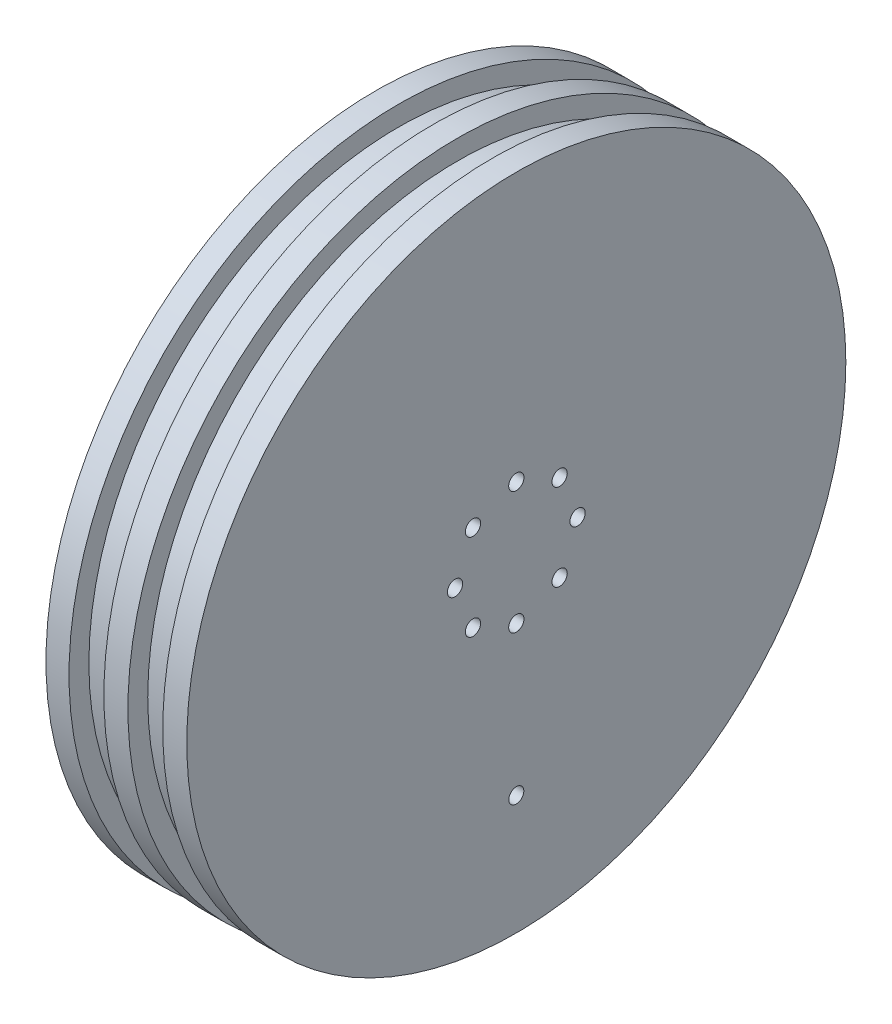
ISO-10303-21;
HEADER;
FILE_DESCRIPTION(('STEP AP214'),'2;1');
FILE_NAME('part.step','',(''),(''),'','','');
FILE_SCHEMA(('AUTOMOTIVE_DESIGN { 1 0 10303 214 1 1 1 1 }'));
ENDSEC;
DATA;
#1=APPLICATION_CONTEXT('core data for automotive mechanical design processes');
#2=APPLICATION_PROTOCOL_DEFINITION('international standard','automotive_design',2000,#1);
#3=PRODUCT_CONTEXT('',#1,'mechanical');
#4=PRODUCT('Part','Part','',(#3));
#5=PRODUCT_RELATED_PRODUCT_CATEGORY('part','',(#4));
#6=PRODUCT_DEFINITION_FORMATION('','',#4);
#7=PRODUCT_DEFINITION_CONTEXT('part definition',#1,'design');
#8=PRODUCT_DEFINITION('design','',#6,#7);
#9=PRODUCT_DEFINITION_SHAPE('','',#8);
#10=(LENGTH_UNIT() NAMED_UNIT(*) SI_UNIT(.MILLI.,.METRE.));
#11=(NAMED_UNIT(*) PLANE_ANGLE_UNIT() SI_UNIT($,.RADIAN.));
#12=(NAMED_UNIT(*) SI_UNIT($,.STERADIAN.) SOLID_ANGLE_UNIT());
#13=UNCERTAINTY_MEASURE_WITH_UNIT(LENGTH_MEASURE(1.E-05),#10,'distance_accuracy_value','');
#14=(GEOMETRIC_REPRESENTATION_CONTEXT(3) GLOBAL_UNCERTAINTY_ASSIGNED_CONTEXT((#13)) GLOBAL_UNIT_ASSIGNED_CONTEXT((#10,
#11,#12)) REPRESENTATION_CONTEXT('',''));
#15=CARTESIAN_POINT('',(0.,0.,0.));
#16=DIRECTION('',(0.,0.,1.));
#17=DIRECTION('',(1.,0.,0.));
#18=AXIS2_PLACEMENT_3D('',#15,#16,#17);
#19=CARTESIAN_POINT('',(-14.885,0.,0.));
#20=DIRECTION('',(-1.,0.,0.));
#21=DIRECTION('',(0.,0.,1.));
#22=AXIS2_PLACEMENT_3D('',#19,#20,#21);
#23=PLANE('',#22);
#24=CARTESIAN_POINT('',(-14.885,0.,0.));
#25=DIRECTION('',(1.,0.,0.));
#26=DIRECTION('',(0.,0.,-1.));
#27=AXIS2_PLACEMENT_3D('',#24,#25,#26);
#28=CIRCLE('',#27,29.1592);
#29=CARTESIAN_POINT('',(-14.885,0.,-29.1592));
#30=VERTEX_POINT('',#29);
#31=EDGE_CURVE('E11',#30,#30,#28,.T.);
#32=ORIENTED_EDGE('',*,*,#31,.T.);
#33=EDGE_LOOP('',(#32));
#34=FACE_BOUND('',#33,.T.);
#35=CARTESIAN_POINT('',(-14.885,0.,0.));
#36=DIRECTION('',(1.,0.,0.));
#37=DIRECTION('',(0.,0.,-1.));
#38=AXIS2_PLACEMENT_3D('',#35,#36,#37);
#39=CIRCLE('',#38,34.8361);
#40=CARTESIAN_POINT('',(-14.885,0.,-34.8361));
#41=VERTEX_POINT('',#40);
#42=EDGE_CURVE('E93',#41,#41,#39,.T.);
#43=ORIENTED_EDGE('',*,*,#42,.F.);
#44=EDGE_LOOP('',(#43));
#45=FACE_BOUND('',#44,.T.);
#46=ADVANCED_FACE('F37',(#34,#45),#23,.T.);
#47=CARTESIAN_POINT('',(17.7798798469095,0.,0.));
#48=DIRECTION('',(1.,0.,0.));
#49=DIRECTION('',(0.,0.,-1.));
#50=AXIS2_PLACEMENT_3D('',#47,#48,#49);
#51=CYLINDRICAL_SURFACE('',#50,29.1592);
#52=CARTESIAN_POINT('',(-18.06,0.,0.));
#53=DIRECTION('',(1.,0.,0.));
#54=DIRECTION('',(0.,0.,-1.));
#55=AXIS2_PLACEMENT_3D('',#52,#53,#54);
#56=CIRCLE('',#55,29.1592);
#57=CARTESIAN_POINT('',(-18.06,0.,-29.1592));
#58=VERTEX_POINT('',#57);
#59=EDGE_CURVE('E45',#58,#58,#56,.T.);
#60=ORIENTED_EDGE('',*,*,#59,.T.);
#61=EDGE_LOOP('',(#60));
#62=FACE_BOUND('',#61,.T.);
#63=ORIENTED_EDGE('',*,*,#31,.F.);
#64=EDGE_LOOP('',(#63));
#65=FACE_BOUND('',#64,.T.);
#66=ADVANCED_FACE('F126',(#62,#65),#51,.T.);
#67=CARTESIAN_POINT('',(-18.06,0.,0.));
#68=DIRECTION('',(-1.,0.,0.));
#69=DIRECTION('',(0.,0.,1.));
#70=AXIS2_PLACEMENT_3D('',#67,#68,#69);
#71=PLANE('',#70);
#72=CARTESIAN_POINT('',(-18.06,-22.225,-1.49186218934006E-13));
#73=DIRECTION('',(-1.,0.,0.));
#74=DIRECTION('',(0.,0.,1.));
#75=AXIS2_PLACEMENT_3D('',#72,#73,#74);
#76=CIRCLE('',#75,4.21639999999999);
#77=CARTESIAN_POINT('',(-18.06,-22.225,4.21639999999984));
#78=VERTEX_POINT('',#77);
#79=EDGE_CURVE('E280',#78,#78,#76,.T.);
#80=ORIENTED_EDGE('',*,*,#79,.F.);
#81=EDGE_LOOP('',(#80));
#82=FACE_BOUND('',#81,.T.);
#83=CARTESIAN_POINT('',(-18.06,6.477,0.));
#84=DIRECTION('',(-1.,0.,0.));
#85=DIRECTION('',(0.,0.,1.));
#86=AXIS2_PLACEMENT_3D('',#83,#84,#85);
#87=CIRCLE('',#86,0.80645);
#88=CARTESIAN_POINT('',(-18.06,6.477,0.80645));
#89=VERTEX_POINT('',#88);
#90=EDGE_CURVE('E75',#89,#89,#87,.F.);
#91=ORIENTED_EDGE('',*,*,#90,.T.);
#92=EDGE_LOOP('',(#91));
#93=FACE_BOUND('',#92,.T.);
#94=CARTESIAN_POINT('',(-18.06,4.57993062174527,-4.57993062174527));
#95=DIRECTION('',(-1.,0.,0.));
#96=DIRECTION('',(0.,0.,1.));
#97=AXIS2_PLACEMENT_3D('',#94,#95,#96);
#98=CIRCLE('',#97,0.80645);
#99=CARTESIAN_POINT('',(-18.06,4.57993062174527,-3.77348062174527));
#100=VERTEX_POINT('',#99);
#101=EDGE_CURVE('E291',#100,#100,#98,.F.);
#102=ORIENTED_EDGE('',*,*,#101,.T.);
#103=EDGE_LOOP('',(#102));
#104=FACE_BOUND('',#103,.T.);
#105=CARTESIAN_POINT('',(-18.06,0.,-6.477));
#106=DIRECTION('',(-1.,0.,0.));
#107=DIRECTION('',(0.,0.,1.));
#108=AXIS2_PLACEMENT_3D('',#105,#106,#107);
#109=CIRCLE('',#108,0.80645);
#110=CARTESIAN_POINT('',(-18.06,0.,-5.67055));
#111=VERTEX_POINT('',#110);
#112=EDGE_CURVE('E297',#111,#111,#109,.F.);
#113=ORIENTED_EDGE('',*,*,#112,.T.);
#114=EDGE_LOOP('',(#113));
#115=FACE_BOUND('',#114,.T.);
#116=CARTESIAN_POINT('',(-18.06,-4.57993062174527,-4.57993062174527));
#117=DIRECTION('',(-1.,0.,0.));
#118=DIRECTION('',(0.,0.,1.));
#119=AXIS2_PLACEMENT_3D('',#116,#117,#118);
#120=CIRCLE('',#119,0.80645);
#121=CARTESIAN_POINT('',(-18.06,-4.57993062174527,-3.77348062174527));
#122=VERTEX_POINT('',#121);
#123=EDGE_CURVE('E303',#122,#122,#120,.F.);
#124=ORIENTED_EDGE('',*,*,#123,.T.);
#125=EDGE_LOOP('',(#124));
#126=FACE_BOUND('',#125,.T.);
#127=CARTESIAN_POINT('',(-18.06,-6.477,0.));
#128=DIRECTION('',(-1.,0.,0.));
#129=DIRECTION('',(0.,0.,1.));
#130=AXIS2_PLACEMENT_3D('',#127,#128,#129);
#131=CIRCLE('',#130,0.80645);
#132=CARTESIAN_POINT('',(-18.06,-6.477,0.806449999999999));
#133=VERTEX_POINT('',#132);
#134=EDGE_CURVE('E309',#133,#133,#131,.F.);
#135=ORIENTED_EDGE('',*,*,#134,.T.);
#136=EDGE_LOOP('',(#135));
#137=FACE_BOUND('',#136,.T.);
#138=CARTESIAN_POINT('',(-18.06,-4.57993062174527,4.57993062174527));
#139=DIRECTION('',(-1.,0.,0.));
#140=DIRECTION('',(0.,0.,1.));
#141=AXIS2_PLACEMENT_3D('',#138,#139,#140);
#142=CIRCLE('',#141,0.80645);
#143=CARTESIAN_POINT('',(-18.06,-4.57993062174527,5.38638062174527));
#144=VERTEX_POINT('',#143);
#145=EDGE_CURVE('E315',#144,#144,#142,.F.);
#146=ORIENTED_EDGE('',*,*,#145,.T.);
#147=EDGE_LOOP('',(#146));
#148=FACE_BOUND('',#147,.T.);
#149=CARTESIAN_POINT('',(-18.06,0.,6.477));
#150=DIRECTION('',(-1.,0.,0.));
#151=DIRECTION('',(0.,0.,1.));
#152=AXIS2_PLACEMENT_3D('',#149,#150,#151);
#153=CIRCLE('',#152,0.80645);
#154=CARTESIAN_POINT('',(-18.06,0.,7.28345));
#155=VERTEX_POINT('',#154);
#156=EDGE_CURVE('E321',#155,#155,#153,.F.);
#157=ORIENTED_EDGE('',*,*,#156,.T.);
#158=EDGE_LOOP('',(#157));
#159=FACE_BOUND('',#158,.T.);
#160=CARTESIAN_POINT('',(-18.06,4.57993062174527,4.57993062174527));
#161=DIRECTION('',(-1.,0.,0.));
#162=DIRECTION('',(0.,0.,1.));
#163=AXIS2_PLACEMENT_3D('',#160,#161,#162);
#164=CIRCLE('',#163,0.80645);
#165=CARTESIAN_POINT('',(-18.06,4.57993062174527,5.38638062174527));
#166=VERTEX_POINT('',#165);
#167=EDGE_CURVE('E327',#166,#166,#164,.F.);
#168=ORIENTED_EDGE('',*,*,#167,.T.);
#169=EDGE_LOOP('',(#168));
#170=FACE_BOUND('',#169,.T.);
#171=CARTESIAN_POINT('',(-18.06,10.31875,17.8725992706014));
#172=DIRECTION('',(-1.,0.,0.));
#173=DIRECTION('',(0.,0.,1.));
#174=AXIS2_PLACEMENT_3D('',#171,#172,#173);
#175=CIRCLE('',#174,0.888999999999989);
#176=CARTESIAN_POINT('',(-18.06,10.31875,18.7615992706014));
#177=VERTEX_POINT('',#176);
#178=EDGE_CURVE('E69',#177,#177,#175,.T.);
#179=ORIENTED_EDGE('',*,*,#178,.F.);
#180=EDGE_LOOP('',(#179));
#181=FACE_BOUND('',#180,.T.);
#182=CARTESIAN_POINT('',(-18.06,-10.3187499999998,-17.8725992706014));
#183=DIRECTION('',(-1.,0.,0.));
#184=DIRECTION('',(0.,0.,1.));
#185=AXIS2_PLACEMENT_3D('',#182,#183,#184);
#186=CIRCLE('',#185,2.0447);
#187=CARTESIAN_POINT('',(-18.06,-10.3187499999998,-15.8278992706015));
#188=VERTEX_POINT('',#187);
#189=EDGE_CURVE('E68',#188,#188,#186,.T.);
#190=ORIENTED_EDGE('',*,*,#189,.F.);
#191=EDGE_LOOP('',(#190));
#192=FACE_BOUND('',#191,.T.);
#193=CARTESIAN_POINT('',(-18.06,-10.3187500000001,17.8725992706013));
#194=DIRECTION('',(-1.,0.,0.));
#195=DIRECTION('',(0.,0.,1.));
#196=AXIS2_PLACEMENT_3D('',#193,#194,#195);
#197=CIRCLE('',#196,2.0447);
#198=CARTESIAN_POINT('',(-18.06,-10.3187500000001,19.9172992706013));
#199=VERTEX_POINT('',#198);
#200=EDGE_CURVE('E81',#199,#199,#197,.T.);
#201=ORIENTED_EDGE('',*,*,#200,.F.);
#202=EDGE_LOOP('',(#201));
#203=FACE_BOUND('',#202,.T.);
#204=CARTESIAN_POINT('',(-18.06,20.6375,0.));
#205=DIRECTION('',(-1.,0.,0.));
#206=DIRECTION('',(0.,0.,1.));
#207=AXIS2_PLACEMENT_3D('',#204,#205,#206);
#208=CIRCLE('',#207,2.0447);
#209=CARTESIAN_POINT('',(-18.06,20.6375,2.0447));
#210=VERTEX_POINT('',#209);
#211=EDGE_CURVE('E87',#210,#210,#208,.T.);
#212=ORIENTED_EDGE('',*,*,#211,.F.);
#213=EDGE_LOOP('',(#212));
#214=FACE_BOUND('',#213,.T.);
#215=ORIENTED_EDGE('',*,*,#59,.F.);
#216=EDGE_LOOP('',(#215));
#217=FACE_BOUND('',#216,.T.);
#218=ADVANCED_FACE('F129',(#82,#93,#104,#115,#126,#137,#148,#159,#170,#181,#192,#203,#214,#217),
#71,.T.);
#219=CARTESIAN_POINT('',(0.,0.,0.));
#220=DIRECTION('',(1.,0.,0.));
#221=DIRECTION('',(0.,0.,-1.));
#222=AXIS2_PLACEMENT_3D('',#219,#220,#221);
#223=PLANE('',#222);
#224=CARTESIAN_POINT('',(0.,-22.225,-1.49186218934006E-13));
#225=DIRECTION('',(1.,0.,0.));
#226=DIRECTION('',(0.,0.,-1.));
#227=AXIS2_PLACEMENT_3D('',#224,#225,#226);
#228=CIRCLE('',#227,0.793749999999999);
#229=CARTESIAN_POINT('',(0.,-22.225,-0.793750000000149));
#230=VERTEX_POINT('',#229);
#231=EDGE_CURVE('E284',#230,#230,#228,.T.);
#232=ORIENTED_EDGE('',*,*,#231,.F.);
#233=EDGE_LOOP('',(#232));
#234=FACE_BOUND('',#233,.T.);
#235=CARTESIAN_POINT('',(0.,6.477,0.));
#236=DIRECTION('',(1.,0.,0.));
#237=DIRECTION('',(0.,0.,-1.));
#238=AXIS2_PLACEMENT_3D('',#235,#236,#237);
#239=CIRCLE('',#238,0.80645);
#240=CARTESIAN_POINT('',(0.,6.477,-0.80645));
#241=VERTEX_POINT('',#240);
#242=EDGE_CURVE('E288',#241,#241,#239,.T.);
#243=ORIENTED_EDGE('',*,*,#242,.F.);
#244=EDGE_LOOP('',(#243));
#245=FACE_BOUND('',#244,.T.);
#246=CARTESIAN_POINT('',(0.,4.57993062174527,-4.57993062174527));
#247=DIRECTION('',(1.,0.,0.));
#248=DIRECTION('',(0.,0.,-1.));
#249=AXIS2_PLACEMENT_3D('',#246,#247,#248);
#250=CIRCLE('',#249,0.80645);
#251=CARTESIAN_POINT('',(0.,4.57993062174527,-5.38638062174527));
#252=VERTEX_POINT('',#251);
#253=EDGE_CURVE('E294',#252,#252,#250,.T.);
#254=ORIENTED_EDGE('',*,*,#253,.F.);
#255=EDGE_LOOP('',(#254));
#256=FACE_BOUND('',#255,.T.);
#257=CARTESIAN_POINT('',(0.,0.,-6.477));
#258=DIRECTION('',(1.,0.,0.));
#259=DIRECTION('',(0.,0.,-1.));
#260=AXIS2_PLACEMENT_3D('',#257,#258,#259);
#261=CIRCLE('',#260,0.80645);
#262=CARTESIAN_POINT('',(0.,0.,-7.28345));
#263=VERTEX_POINT('',#262);
#264=EDGE_CURVE('E300',#263,#263,#261,.T.);
#265=ORIENTED_EDGE('',*,*,#264,.F.);
#266=EDGE_LOOP('',(#265));
#267=FACE_BOUND('',#266,.T.);
#268=CARTESIAN_POINT('',(0.,-4.57993062174527,-4.57993062174527));
#269=DIRECTION('',(1.,0.,0.));
#270=DIRECTION('',(0.,0.,-1.));
#271=AXIS2_PLACEMENT_3D('',#268,#269,#270);
#272=CIRCLE('',#271,0.80645);
#273=CARTESIAN_POINT('',(0.,-4.57993062174527,-5.38638062174527));
#274=VERTEX_POINT('',#273);
#275=EDGE_CURVE('E306',#274,#274,#272,.T.);
#276=ORIENTED_EDGE('',*,*,#275,.F.);
#277=EDGE_LOOP('',(#276));
#278=FACE_BOUND('',#277,.T.);
#279=CARTESIAN_POINT('',(0.,-6.477,0.));
#280=DIRECTION('',(1.,0.,0.));
#281=DIRECTION('',(0.,0.,-1.));
#282=AXIS2_PLACEMENT_3D('',#279,#280,#281);
#283=CIRCLE('',#282,0.80645);
#284=CARTESIAN_POINT('',(0.,-6.477,-0.806450000000001));
#285=VERTEX_POINT('',#284);
#286=EDGE_CURVE('E312',#285,#285,#283,.T.);
#287=ORIENTED_EDGE('',*,*,#286,.F.);
#288=EDGE_LOOP('',(#287));
#289=FACE_BOUND('',#288,.T.);
#290=CARTESIAN_POINT('',(0.,-4.57993062174527,4.57993062174527));
#291=DIRECTION('',(1.,0.,0.));
#292=DIRECTION('',(0.,0.,-1.));
#293=AXIS2_PLACEMENT_3D('',#290,#291,#292);
#294=CIRCLE('',#293,0.80645);
#295=CARTESIAN_POINT('',(0.,-4.57993062174527,3.77348062174527));
#296=VERTEX_POINT('',#295);
#297=EDGE_CURVE('E318',#296,#296,#294,.T.);
#298=ORIENTED_EDGE('',*,*,#297,.F.);
#299=EDGE_LOOP('',(#298));
#300=FACE_BOUND('',#299,.T.);
#301=CARTESIAN_POINT('',(0.,0.,6.477));
#302=DIRECTION('',(1.,0.,0.));
#303=DIRECTION('',(0.,0.,-1.));
#304=AXIS2_PLACEMENT_3D('',#301,#302,#303);
#305=CIRCLE('',#304,0.80645);
#306=CARTESIAN_POINT('',(0.,0.,5.67055));
#307=VERTEX_POINT('',#306);
#308=EDGE_CURVE('E324',#307,#307,#305,.T.);
#309=ORIENTED_EDGE('',*,*,#308,.F.);
#310=EDGE_LOOP('',(#309));
#311=FACE_BOUND('',#310,.T.);
#312=CARTESIAN_POINT('',(0.,4.57993062174527,4.57993062174527));
#313=DIRECTION('',(1.,0.,0.));
#314=DIRECTION('',(0.,0.,-1.));
#315=AXIS2_PLACEMENT_3D('',#312,#313,#314);
#316=CIRCLE('',#315,0.80645);
#317=CARTESIAN_POINT('',(0.,4.57993062174527,3.77348062174527));
#318=VERTEX_POINT('',#317);
#319=EDGE_CURVE('E287',#318,#318,#316,.T.);
#320=ORIENTED_EDGE('',*,*,#319,.F.);
#321=EDGE_LOOP('',(#320));
#322=FACE_BOUND('',#321,.T.);
#323=CARTESIAN_POINT('',(0.,0.,0.));
#324=DIRECTION('',(1.,0.,0.));
#325=DIRECTION('',(0.,0.,-1.));
#326=AXIS2_PLACEMENT_3D('',#323,#324,#325);
#327=CIRCLE('',#326,34.8361);
#328=CARTESIAN_POINT('',(0.,0.,-34.8361));
#329=VERTEX_POINT('',#328);
#330=EDGE_CURVE('E120',#329,#329,#327,.T.);
#331=ORIENTED_EDGE('',*,*,#330,.T.);
#332=EDGE_LOOP('',(#331));
#333=FACE_BOUND('',#332,.T.);
#334=ADVANCED_FACE('F131',(#234,#245,#256,#267,#278,#289,#300,#311,#322,#333),#223,.T.);
#335=CARTESIAN_POINT('',(17.7798798469095,0.,0.));
#336=DIRECTION('',(1.,0.,0.));
#337=DIRECTION('',(0.,0.,-1.));
#338=AXIS2_PLACEMENT_3D('',#335,#336,#337);
#339=CYLINDRICAL_SURFACE('',#338,34.8361);
#340=CARTESIAN_POINT('',(-2.53999999999999,0.,0.));
#341=DIRECTION('',(1.,0.,0.));
#342=DIRECTION('',(0.,0.,-1.));
#343=AXIS2_PLACEMENT_3D('',#340,#341,#342);
#344=CIRCLE('',#343,34.8361);
#345=CARTESIAN_POINT('',(-2.53999999999999,0.,-34.8361));
#346=VERTEX_POINT('',#345);
#347=EDGE_CURVE('E117',#346,#346,#344,.T.);
#348=ORIENTED_EDGE('',*,*,#347,.T.);
#349=EDGE_LOOP('',(#348));
#350=FACE_BOUND('',#349,.T.);
#351=ORIENTED_EDGE('',*,*,#330,.F.);
#352=EDGE_LOOP('',(#351));
#353=FACE_BOUND('',#352,.T.);
#354=ADVANCED_FACE('F138',(#350,#353),#339,.T.);
#355=CARTESIAN_POINT('',(-2.53999999999999,0.,0.));
#356=DIRECTION('',(-1.,0.,0.));
#357=DIRECTION('',(0.,0.,1.));
#358=AXIS2_PLACEMENT_3D('',#355,#356,#357);
#359=PLANE('',#358);
#360=CARTESIAN_POINT('',(-2.53999999999999,0.,0.));
#361=DIRECTION('',(1.,0.,0.));
#362=DIRECTION('',(0.,0.,-1.));
#363=AXIS2_PLACEMENT_3D('',#360,#361,#362);
#364=CIRCLE('',#363,32.7406);
#365=CARTESIAN_POINT('',(-2.53999999999999,0.,-32.7406));
#366=VERTEX_POINT('',#365);
#367=EDGE_CURVE('E114',#366,#366,#364,.T.);
#368=ORIENTED_EDGE('',*,*,#367,.T.);
#369=EDGE_LOOP('',(#368));
#370=FACE_BOUND('',#369,.T.);
#371=ORIENTED_EDGE('',*,*,#347,.F.);
#372=EDGE_LOOP('',(#371));
#373=FACE_BOUND('',#372,.T.);
#374=ADVANCED_FACE('F191',(#370,#373),#359,.T.);
#375=CARTESIAN_POINT('',(17.7798798469095,0.,0.));
#376=DIRECTION('',(1.,0.,0.));
#377=DIRECTION('',(0.,0.,-1.));
#378=AXIS2_PLACEMENT_3D('',#375,#376,#377);
#379=CYLINDRICAL_SURFACE('',#378,32.7406);
#380=CARTESIAN_POINT('',(-6.223,0.,0.));
#381=DIRECTION('',(1.,0.,0.));
#382=DIRECTION('',(0.,0.,-1.));
#383=AXIS2_PLACEMENT_3D('',#380,#381,#382);
#384=CIRCLE('',#383,32.7406);
#385=CARTESIAN_POINT('',(-6.223,0.,-32.7406));
#386=VERTEX_POINT('',#385);
#387=EDGE_CURVE('E111',#386,#386,#384,.T.);
#388=ORIENTED_EDGE('',*,*,#387,.T.);
#389=EDGE_LOOP('',(#388));
#390=FACE_BOUND('',#389,.T.);
#391=ORIENTED_EDGE('',*,*,#367,.F.);
#392=EDGE_LOOP('',(#391));
#393=FACE_BOUND('',#392,.T.);
#394=ADVANCED_FACE('F185',(#390,#393),#379,.T.);
#395=CARTESIAN_POINT('',(-6.22299999999999,0.,0.));
#396=DIRECTION('',(1.,0.,0.));
#397=DIRECTION('',(0.,0.,-1.));
#398=AXIS2_PLACEMENT_3D('',#395,#396,#397);
#399=PLANE('',#398);
#400=CARTESIAN_POINT('',(-6.22299999999999,0.,0.));
#401=DIRECTION('',(1.,0.,0.));
#402=DIRECTION('',(0.,0.,-1.));
#403=AXIS2_PLACEMENT_3D('',#400,#401,#402);
#404=CIRCLE('',#403,34.8361);
#405=CARTESIAN_POINT('',(-6.22299999999999,0.,-34.8361));
#406=VERTEX_POINT('',#405);
#407=EDGE_CURVE('E108',#406,#406,#404,.T.);
#408=ORIENTED_EDGE('',*,*,#407,.T.);
#409=EDGE_LOOP('',(#408));
#410=FACE_BOUND('',#409,.T.);
#411=ORIENTED_EDGE('',*,*,#387,.F.);
#412=EDGE_LOOP('',(#411));
#413=FACE_BOUND('',#412,.T.);
#414=ADVANCED_FACE('F179',(#410,#413),#399,.T.);
#415=CARTESIAN_POINT('',(17.7798798469095,0.,0.));
#416=DIRECTION('',(1.,0.,0.));
#417=DIRECTION('',(0.,0.,-1.));
#418=AXIS2_PLACEMENT_3D('',#415,#416,#417);
#419=CYLINDRICAL_SURFACE('',#418,34.8361);
#420=CARTESIAN_POINT('',(-8.76299999999999,0.,0.));
#421=DIRECTION('',(1.,0.,0.));
#422=DIRECTION('',(0.,0.,-1.));
#423=AXIS2_PLACEMENT_3D('',#420,#421,#422);
#424=CIRCLE('',#423,34.8361);
#425=CARTESIAN_POINT('',(-8.76299999999999,0.,-34.8361));
#426=VERTEX_POINT('',#425);
#427=EDGE_CURVE('E105',#426,#426,#424,.T.);
#428=ORIENTED_EDGE('',*,*,#427,.T.);
#429=EDGE_LOOP('',(#428));
#430=FACE_BOUND('',#429,.T.);
#431=ORIENTED_EDGE('',*,*,#407,.F.);
#432=EDGE_LOOP('',(#431));
#433=FACE_BOUND('',#432,.T.);
#434=ADVANCED_FACE('F173',(#430,#433),#419,.T.);
#435=CARTESIAN_POINT('',(-8.76299999999999,0.,0.));
#436=DIRECTION('',(-1.,0.,0.));
#437=DIRECTION('',(0.,0.,1.));
#438=AXIS2_PLACEMENT_3D('',#435,#436,#437);
#439=PLANE('',#438);
#440=CARTESIAN_POINT('',(-8.76299999999999,0.,0.));
#441=DIRECTION('',(1.,0.,0.));
#442=DIRECTION('',(0.,0.,-1.));
#443=AXIS2_PLACEMENT_3D('',#440,#441,#442);
#444=CIRCLE('',#443,32.7406);
#445=CARTESIAN_POINT('',(-8.76299999999999,0.,-32.7406));
#446=VERTEX_POINT('',#445);
#447=EDGE_CURVE('E102',#446,#446,#444,.T.);
#448=ORIENTED_EDGE('',*,*,#447,.T.);
#449=EDGE_LOOP('',(#448));
#450=FACE_BOUND('',#449,.T.);
#451=ORIENTED_EDGE('',*,*,#427,.F.);
#452=EDGE_LOOP('',(#451));
#453=FACE_BOUND('',#452,.T.);
#454=ADVANCED_FACE('F167',(#450,#453),#439,.T.);
#455=CARTESIAN_POINT('',(17.7798798469095,0.,0.));
#456=DIRECTION('',(1.,0.,0.));
#457=DIRECTION('',(0.,0.,-1.));
#458=AXIS2_PLACEMENT_3D('',#455,#456,#457);
#459=CYLINDRICAL_SURFACE('',#458,32.7406);
#460=CARTESIAN_POINT('',(-12.446,0.,0.));
#461=DIRECTION('',(1.,0.,0.));
#462=DIRECTION('',(0.,0.,-1.));
#463=AXIS2_PLACEMENT_3D('',#460,#461,#462);
#464=CIRCLE('',#463,32.7406);
#465=CARTESIAN_POINT('',(-12.446,0.,-32.7406));
#466=VERTEX_POINT('',#465);
#467=EDGE_CURVE('E99',#466,#466,#464,.T.);
#468=ORIENTED_EDGE('',*,*,#467,.T.);
#469=EDGE_LOOP('',(#468));
#470=FACE_BOUND('',#469,.T.);
#471=ORIENTED_EDGE('',*,*,#447,.F.);
#472=EDGE_LOOP('',(#471));
#473=FACE_BOUND('',#472,.T.);
#474=ADVANCED_FACE('F161',(#470,#473),#459,.T.);
#475=CARTESIAN_POINT('',(-12.446,0.,0.));
#476=DIRECTION('',(1.,0.,0.));
#477=DIRECTION('',(0.,0.,-1.));
#478=AXIS2_PLACEMENT_3D('',#475,#476,#477);
#479=PLANE('',#478);
#480=CARTESIAN_POINT('',(-12.446,0.,0.));
#481=DIRECTION('',(1.,0.,0.));
#482=DIRECTION('',(0.,0.,-1.));
#483=AXIS2_PLACEMENT_3D('',#480,#481,#482);
#484=CIRCLE('',#483,34.8361);
#485=CARTESIAN_POINT('',(-12.446,0.,-34.8361));
#486=VERTEX_POINT('',#485);
#487=EDGE_CURVE('E96',#486,#486,#484,.T.);
#488=ORIENTED_EDGE('',*,*,#487,.T.);
#489=EDGE_LOOP('',(#488));
#490=FACE_BOUND('',#489,.T.);
#491=ORIENTED_EDGE('',*,*,#467,.F.);
#492=EDGE_LOOP('',(#491));
#493=FACE_BOUND('',#492,.T.);
#494=ADVANCED_FACE('F155',(#490,#493),#479,.T.);
#495=CARTESIAN_POINT('',(17.7798798469095,0.,0.));
#496=DIRECTION('',(1.,0.,0.));
#497=DIRECTION('',(0.,0.,-1.));
#498=AXIS2_PLACEMENT_3D('',#495,#496,#497);
#499=CYLINDRICAL_SURFACE('',#498,34.8361);
#500=ORIENTED_EDGE('',*,*,#42,.T.);
#501=EDGE_LOOP('',(#500));
#502=FACE_BOUND('',#501,.T.);
#503=ORIENTED_EDGE('',*,*,#487,.F.);
#504=EDGE_LOOP('',(#503));
#505=FACE_BOUND('',#504,.T.);
#506=ADVANCED_FACE('F151',(#502,#505),#499,.T.);
#507=CARTESIAN_POINT('',(-8.408,20.6375,0.));
#508=DIRECTION('',(-1.,0.,0.));
#509=DIRECTION('',(0.,0.,1.));
#510=AXIS2_PLACEMENT_3D('',#507,#508,#509);
#511=CONICAL_SURFACE('',#510,2.0447,1.02974425867665);
#512=CARTESIAN_POINT('',(-7.17942029227434,20.6375,0.));
#513=VERTEX_POINT('',#512);
#514=VERTEX_LOOP('',#513);
#515=FACE_BOUND('',#514,.T.);
#516=CARTESIAN_POINT('',(-8.408,20.6375,0.));
#517=DIRECTION('',(-1.,0.,0.));
#518=DIRECTION('',(0.,0.,1.));
#519=AXIS2_PLACEMENT_3D('',#516,#517,#518);
#520=CIRCLE('',#519,2.0447);
#521=CARTESIAN_POINT('',(-8.408,20.6375,2.0447));
#522=VERTEX_POINT('',#521);
#523=EDGE_CURVE('E90',#522,#522,#520,.T.);
#524=ORIENTED_EDGE('',*,*,#523,.T.);
#525=EDGE_LOOP('',(#524));
#526=FACE_BOUND('',#525,.T.);
#527=ADVANCED_FACE('F154',(#515,#526),#511,.F.);
#528=CARTESIAN_POINT('',(-18.06,20.6375,0.));
#529=DIRECTION('',(-1.,0.,0.));
#530=DIRECTION('',(0.,0.,1.));
#531=AXIS2_PLACEMENT_3D('',#528,#529,#530);
#532=CYLINDRICAL_SURFACE('',#531,2.0447);
#533=ORIENTED_EDGE('',*,*,#523,.F.);
#534=EDGE_LOOP('',(#533));
#535=FACE_BOUND('',#534,.T.);
#536=ORIENTED_EDGE('',*,*,#211,.T.);
#537=EDGE_LOOP('',(#536));
#538=FACE_BOUND('',#537,.T.);
#539=ADVANCED_FACE('F210',(#535,#538),#532,.F.);
#540=CARTESIAN_POINT('',(-8.408,-10.3187500000001,17.8725992706013));
#541=DIRECTION('',(-1.,0.,0.));
#542=DIRECTION('',(0.,0.,1.));
#543=AXIS2_PLACEMENT_3D('',#540,#541,#542);
#544=CONICAL_SURFACE('',#543,2.0447,1.02974425867665);
#545=CARTESIAN_POINT('',(-7.17942029227434,-10.3187500000001,17.8725992706013));
#546=VERTEX_POINT('',#545);
#547=VERTEX_LOOP('',#546);
#548=FACE_BOUND('',#547,.T.);
#549=CARTESIAN_POINT('',(-8.408,-10.3187500000001,17.8725992706013));
#550=DIRECTION('',(-1.,0.,0.));
#551=DIRECTION('',(0.,0.,1.));
#552=AXIS2_PLACEMENT_3D('',#549,#550,#551);
#553=CIRCLE('',#552,2.0447);
#554=CARTESIAN_POINT('',(-8.408,-10.3187500000001,19.9172992706013));
#555=VERTEX_POINT('',#554);
#556=EDGE_CURVE('E84',#555,#555,#553,.T.);
#557=ORIENTED_EDGE('',*,*,#556,.T.);
#558=EDGE_LOOP('',(#557));
#559=FACE_BOUND('',#558,.T.);
#560=ADVANCED_FACE('F213',(#548,#559),#544,.F.);
#561=CARTESIAN_POINT('',(-18.06,-10.3187500000001,17.8725992706013));
#562=DIRECTION('',(-1.,0.,0.));
#563=DIRECTION('',(0.,0.,1.));
#564=AXIS2_PLACEMENT_3D('',#561,#562,#563);
#565=CYLINDRICAL_SURFACE('',#564,2.0447);
#566=ORIENTED_EDGE('',*,*,#556,.F.);
#567=EDGE_LOOP('',(#566));
#568=FACE_BOUND('',#567,.T.);
#569=ORIENTED_EDGE('',*,*,#200,.T.);
#570=EDGE_LOOP('',(#569));
#571=FACE_BOUND('',#570,.T.);
#572=ADVANCED_FACE('F217',(#568,#571),#565,.F.);
#573=CARTESIAN_POINT('',(-8.408,-10.3187499999998,-17.8725992706014));
#574=DIRECTION('',(-1.,0.,0.));
#575=DIRECTION('',(0.,0.,1.));
#576=AXIS2_PLACEMENT_3D('',#573,#574,#575);
#577=CONICAL_SURFACE('',#576,2.0447,1.02974425867665);
#578=CARTESIAN_POINT('',(-7.17942029227434,-10.3187499999998,-17.8725992706014));
#579=VERTEX_POINT('',#578);
#580=VERTEX_LOOP('',#579);
#581=FACE_BOUND('',#580,.T.);
#582=CARTESIAN_POINT('',(-8.408,-10.3187499999998,-17.8725992706014));
#583=DIRECTION('',(-1.,0.,0.));
#584=DIRECTION('',(0.,0.,1.));
#585=AXIS2_PLACEMENT_3D('',#582,#583,#584);
#586=CIRCLE('',#585,2.0447);
#587=CARTESIAN_POINT('',(-8.408,-10.3187499999998,-15.8278992706015));
#588=VERTEX_POINT('',#587);
#589=EDGE_CURVE('E72',#588,#588,#586,.T.);
#590=ORIENTED_EDGE('',*,*,#589,.T.);
#591=EDGE_LOOP('',(#590));
#592=FACE_BOUND('',#591,.T.);
#593=ADVANCED_FACE('F220',(#581,#592),#577,.F.);
#594=CARTESIAN_POINT('',(-18.06,-10.3187499999998,-17.8725992706014));
#595=DIRECTION('',(-1.,0.,0.));
#596=DIRECTION('',(0.,0.,1.));
#597=AXIS2_PLACEMENT_3D('',#594,#595,#596);
#598=CYLINDRICAL_SURFACE('',#597,2.0447);
#599=ORIENTED_EDGE('',*,*,#589,.F.);
#600=EDGE_LOOP('',(#599));
#601=FACE_BOUND('',#600,.T.);
#602=ORIENTED_EDGE('',*,*,#189,.T.);
#603=EDGE_LOOP('',(#602));
#604=FACE_BOUND('',#603,.T.);
#605=ADVANCED_FACE('F62',(#601,#604),#598,.F.);
#606=CARTESIAN_POINT('',(-6.12199999999999,10.31875,17.8725992706014));
#607=DIRECTION('',(-1.,0.,0.));
#608=DIRECTION('',(0.,0.,1.));
#609=AXIS2_PLACEMENT_3D('',#606,#607,#608);
#610=CONICAL_SURFACE('',#609,0.888999999999987,1.02974425867665);
#611=CARTESIAN_POINT('',(-5.5878349096845,10.3187499999999,17.8725992706014));
#612=VERTEX_POINT('',#611);
#613=VERTEX_LOOP('',#612);
#614=FACE_BOUND('',#613,.T.);
#615=CARTESIAN_POINT('',(-6.12199999999999,10.31875,17.8725992706014));
#616=DIRECTION('',(-1.,0.,0.));
#617=DIRECTION('',(0.,0.,1.));
#618=AXIS2_PLACEMENT_3D('',#615,#616,#617);
#619=CIRCLE('',#618,0.888999999999987);
#620=CARTESIAN_POINT('',(-6.12199999999999,10.31875,18.7615992706014));
#621=VERTEX_POINT('',#620);
#622=EDGE_CURVE('E66',#621,#621,#619,.T.);
#623=ORIENTED_EDGE('',*,*,#622,.T.);
#624=EDGE_LOOP('',(#623));
#625=FACE_BOUND('',#624,.T.);
#626=ADVANCED_FACE('F58',(#614,#625),#610,.F.);
#627=CARTESIAN_POINT('',(-18.06,10.31875,17.8725992706014));
#628=DIRECTION('',(-1.,0.,0.));
#629=DIRECTION('',(0.,0.,1.));
#630=AXIS2_PLACEMENT_3D('',#627,#628,#629);
#631=CYLINDRICAL_SURFACE('',#630,0.888999999999988);
#632=ORIENTED_EDGE('',*,*,#622,.F.);
#633=EDGE_LOOP('',(#632));
#634=FACE_BOUND('',#633,.T.);
#635=ORIENTED_EDGE('',*,*,#178,.T.);
#636=EDGE_LOOP('',(#635));
#637=FACE_BOUND('',#636,.T.);
#638=ADVANCED_FACE('F61',(#634,#637),#631,.F.);
#639=CARTESIAN_POINT('',(-20.3409850547516,4.57993062174527,4.57993062174527));
#640=DIRECTION('',(1.,0.,0.));
#641=DIRECTION('',(0.,0.,-1.));
#642=AXIS2_PLACEMENT_3D('',#639,#640,#641);
#643=CYLINDRICAL_SURFACE('',#642,0.80645);
#644=ORIENTED_EDGE('',*,*,#319,.T.);
#645=EDGE_LOOP('',(#644));
#646=FACE_BOUND('',#645,.T.);
#647=ORIENTED_EDGE('',*,*,#167,.F.);
#648=EDGE_LOOP('',(#647));
#649=FACE_BOUND('',#648,.T.);
#650=ADVANCED_FACE('F230',(#646,#649),#643,.F.);
#651=CARTESIAN_POINT('',(-20.3409850547516,0.,6.477));
#652=DIRECTION('',(1.,0.,0.));
#653=DIRECTION('',(0.,0.,-1.));
#654=AXIS2_PLACEMENT_3D('',#651,#652,#653);
#655=CYLINDRICAL_SURFACE('',#654,0.80645);
#656=ORIENTED_EDGE('',*,*,#308,.T.);
#657=EDGE_LOOP('',(#656));
#658=FACE_BOUND('',#657,.T.);
#659=ORIENTED_EDGE('',*,*,#156,.F.);
#660=EDGE_LOOP('',(#659));
#661=FACE_BOUND('',#660,.T.);
#662=ADVANCED_FACE('F233',(#658,#661),#655,.F.);
#663=CARTESIAN_POINT('',(-20.3409850547516,-4.57993062174527,4.57993062174527));
#664=DIRECTION('',(1.,0.,0.));
#665=DIRECTION('',(0.,0.,-1.));
#666=AXIS2_PLACEMENT_3D('',#663,#664,#665);
#667=CYLINDRICAL_SURFACE('',#666,0.80645);
#668=ORIENTED_EDGE('',*,*,#297,.T.);
#669=EDGE_LOOP('',(#668));
#670=FACE_BOUND('',#669,.T.);
#671=ORIENTED_EDGE('',*,*,#145,.F.);
#672=EDGE_LOOP('',(#671));
#673=FACE_BOUND('',#672,.T.);
#674=ADVANCED_FACE('F237',(#670,#673),#667,.F.);
#675=CARTESIAN_POINT('',(-20.3409850547516,-6.477,0.));
#676=DIRECTION('',(1.,0.,0.));
#677=DIRECTION('',(0.,0.,-1.));
#678=AXIS2_PLACEMENT_3D('',#675,#676,#677);
#679=CYLINDRICAL_SURFACE('',#678,0.80645);
#680=ORIENTED_EDGE('',*,*,#286,.T.);
#681=EDGE_LOOP('',(#680));
#682=FACE_BOUND('',#681,.T.);
#683=ORIENTED_EDGE('',*,*,#134,.F.);
#684=EDGE_LOOP('',(#683));
#685=FACE_BOUND('',#684,.T.);
#686=ADVANCED_FACE('F241',(#682,#685),#679,.F.);
#687=CARTESIAN_POINT('',(-20.3409850547516,-4.57993062174527,-4.57993062174527));
#688=DIRECTION('',(1.,0.,0.));
#689=DIRECTION('',(0.,0.,-1.));
#690=AXIS2_PLACEMENT_3D('',#687,#688,#689);
#691=CYLINDRICAL_SURFACE('',#690,0.80645);
#692=ORIENTED_EDGE('',*,*,#275,.T.);
#693=EDGE_LOOP('',(#692));
#694=FACE_BOUND('',#693,.T.);
#695=ORIENTED_EDGE('',*,*,#123,.F.);
#696=EDGE_LOOP('',(#695));
#697=FACE_BOUND('',#696,.T.);
#698=ADVANCED_FACE('F245',(#694,#697),#691,.F.);
#699=CARTESIAN_POINT('',(-20.3409850547516,0.,-6.477));
#700=DIRECTION('',(1.,0.,0.));
#701=DIRECTION('',(0.,0.,-1.));
#702=AXIS2_PLACEMENT_3D('',#699,#700,#701);
#703=CYLINDRICAL_SURFACE('',#702,0.80645);
#704=ORIENTED_EDGE('',*,*,#264,.T.);
#705=EDGE_LOOP('',(#704));
#706=FACE_BOUND('',#705,.T.);
#707=ORIENTED_EDGE('',*,*,#112,.F.);
#708=EDGE_LOOP('',(#707));
#709=FACE_BOUND('',#708,.T.);
#710=ADVANCED_FACE('F249',(#706,#709),#703,.F.);
#711=CARTESIAN_POINT('',(-20.3409850547516,4.57993062174527,-4.57993062174527));
#712=DIRECTION('',(1.,0.,0.));
#713=DIRECTION('',(0.,0.,-1.));
#714=AXIS2_PLACEMENT_3D('',#711,#712,#713);
#715=CYLINDRICAL_SURFACE('',#714,0.80645);
#716=ORIENTED_EDGE('',*,*,#253,.T.);
#717=EDGE_LOOP('',(#716));
#718=FACE_BOUND('',#717,.T.);
#719=ORIENTED_EDGE('',*,*,#101,.F.);
#720=EDGE_LOOP('',(#719));
#721=FACE_BOUND('',#720,.T.);
#722=ADVANCED_FACE('F253',(#718,#721),#715,.F.);
#723=CARTESIAN_POINT('',(-20.3409850547516,6.477,0.));
#724=DIRECTION('',(1.,0.,0.));
#725=DIRECTION('',(0.,0.,-1.));
#726=AXIS2_PLACEMENT_3D('',#723,#724,#725);
#727=CYLINDRICAL_SURFACE('',#726,0.80645);
#728=ORIENTED_EDGE('',*,*,#242,.T.);
#729=EDGE_LOOP('',(#728));
#730=FACE_BOUND('',#729,.T.);
#731=ORIENTED_EDGE('',*,*,#90,.F.);
#732=EDGE_LOOP('',(#731));
#733=FACE_BOUND('',#732,.T.);
#734=ADVANCED_FACE('F257',(#730,#733),#727,.F.);
#735=CARTESIAN_POINT('',(0.,-22.225,-1.49186218934006E-13));
#736=DIRECTION('',(1.,0.,0.));
#737=DIRECTION('',(0.,0.,-1.));
#738=AXIS2_PLACEMENT_3D('',#735,#736,#737);
#739=CYLINDRICAL_SURFACE('',#738,0.793749999999998);
#740=CARTESIAN_POINT('',(-7.11346440228532,-22.225,-1.49186218934006E-13));
#741=DIRECTION('',(-1.,0.,0.));
#742=DIRECTION('',(0.,0.,1.));
#743=AXIS2_PLACEMENT_3D('',#740,#741,#742);
#744=CIRCLE('',#743,0.793749999999998);
#745=CARTESIAN_POINT('',(-7.11346440228532,-22.225,0.793749999999848));
#746=VERTEX_POINT('',#745);
#747=EDGE_CURVE('E40',#746,#746,#744,.T.);
#748=ORIENTED_EDGE('',*,*,#747,.T.);
#749=EDGE_LOOP('',(#748));
#750=FACE_BOUND('',#749,.T.);
#751=ORIENTED_EDGE('',*,*,#231,.T.);
#752=EDGE_LOOP('',(#751));
#753=FACE_BOUND('',#752,.T.);
#754=ADVANCED_FACE('F261',(#750,#753),#739,.F.);
#755=CARTESIAN_POINT('',(-9.17,-22.225,-1.49186218934006E-13));
#756=DIRECTION('',(-1.,0.,0.));
#757=DIRECTION('',(0.,0.,1.));
#758=AXIS2_PLACEMENT_3D('',#755,#756,#757);
#759=CONICAL_SURFACE('',#758,4.21639999999999,1.02974425867665);
#760=CARTESIAN_POINT('',(-9.17,-22.225,-1.49186218934006E-13));
#761=DIRECTION('',(-1.,0.,0.));
#762=DIRECTION('',(0.,0.,1.));
#763=AXIS2_PLACEMENT_3D('',#760,#761,#762);
#764=CIRCLE('',#763,4.21639999999999);
#765=CARTESIAN_POINT('',(-9.17,-22.225,4.21639999999984));
#766=VERTEX_POINT('',#765);
#767=EDGE_CURVE('E278',#766,#766,#764,.T.);
#768=CARTESIAN_POINT('',(-9.17,-22.225,4.21639999999984));
#769=CARTESIAN_POINT('',(-9.14857775419047,-22.225,4.18074739583317));
#770=CARTESIAN_POINT('',(-9.12715550838094,-22.225,4.1450947916665));
#771=CARTESIAN_POINT('',(-9.08431101676189,-22.225,4.07378958333317));
#772=CARTESIAN_POINT('',(-9.06288877095236,-22.225,4.0381369791665));
#773=CARTESIAN_POINT('',(-9.02004427933331,-22.225,3.96683177083317));
#774=CARTESIAN_POINT('',(-8.99862203352378,-22.225,3.93117916666651));
#775=CARTESIAN_POINT('',(-8.95577754190472,-22.225,3.85987395833317));
#776=CARTESIAN_POINT('',(-8.93435529609519,-22.225,3.82422135416651));
#777=CARTESIAN_POINT('',(-8.89151080447614,-22.225,3.75291614583317));
#778=CARTESIAN_POINT('',(-8.87008855866661,-22.225,3.71726354166651));
#779=CARTESIAN_POINT('',(-8.82724406704756,-22.225,3.64595833333317));
#780=CARTESIAN_POINT('',(-8.80582182123803,-22.225,3.61030572916651));
#781=CARTESIAN_POINT('',(-8.76297732961897,-22.225,3.53900052083317));
#782=CARTESIAN_POINT('',(-8.74155508380944,-22.225,3.50334791666651));
#783=CARTESIAN_POINT('',(-8.69871059219039,-22.225,3.43204270833317));
#784=CARTESIAN_POINT('',(-8.67728834638086,-22.225,3.39639010416651));
#785=CARTESIAN_POINT('',(-8.6344438547618,-22.225,3.32508489583317));
#786=CARTESIAN_POINT('',(-8.61302160895228,-22.225,3.28943229166651));
#787=CARTESIAN_POINT('',(-8.57017711733322,-22.225,3.21812708333317));
#788=CARTESIAN_POINT('',(-8.54875487152369,-22.225,3.18247447916651));
#789=CARTESIAN_POINT('',(-8.50591037990464,-22.225,3.11116927083317));
#790=CARTESIAN_POINT('',(-8.48448813409511,-22.225,3.07551666666651));
#791=CARTESIAN_POINT('',(-8.44164364247605,-22.225,3.00421145833317));
#792=CARTESIAN_POINT('',(-8.42022139666653,-22.225,2.96855885416651));
#793=CARTESIAN_POINT('',(-8.37737690504747,-22.225,2.89725364583317));
#794=CARTESIAN_POINT('',(-8.35595465923794,-22.225,2.86160104166651));
#795=CARTESIAN_POINT('',(-8.31311016761889,-22.225,2.79029583333318));
#796=CARTESIAN_POINT('',(-8.29168792180936,-22.225,2.75464322916651));
#797=CARTESIAN_POINT('',(-8.2488434301903,-22.225,2.68333802083318));
#798=CARTESIAN_POINT('',(-8.22742118438077,-22.225,2.64768541666651));
#799=CARTESIAN_POINT('',(-8.18457669276172,-22.225,2.57638020833318));
#800=CARTESIAN_POINT('',(-8.16315444695219,-22.225,2.54072760416651));
#801=CARTESIAN_POINT('',(-8.12030995533313,-22.225,2.46942239583318));
#802=CARTESIAN_POINT('',(-8.09888770952361,-22.225,2.43376979166651));
#803=CARTESIAN_POINT('',(-8.05604321790455,-22.225,2.36246458333318));
#804=CARTESIAN_POINT('',(-8.03462097209502,-22.225,2.32681197916651));
#805=CARTESIAN_POINT('',(-7.99177648047597,-22.225,2.25550677083318));
#806=CARTESIAN_POINT('',(-7.97035423466644,-22.225,2.21985416666651));
#807=CARTESIAN_POINT('',(-7.92750974304738,-22.225,2.14854895833318));
#808=CARTESIAN_POINT('',(-7.90608749723785,-22.225,2.11289635416651));
#809=CARTESIAN_POINT('',(-7.8632430056188,-22.225,2.04159114583318));
#810=CARTESIAN_POINT('',(-7.84182075980927,-22.225,2.00593854166651));
#811=CARTESIAN_POINT('',(-7.79897626819022,-22.225,1.93463333333318));
#812=CARTESIAN_POINT('',(-7.77755402238069,-22.225,1.89898072916651));
#813=CARTESIAN_POINT('',(-7.73470953076163,-22.225,1.82767552083318));
#814=CARTESIAN_POINT('',(-7.7132872849521,-22.225,1.79202291666651));
#815=CARTESIAN_POINT('',(-7.67044279333305,-22.225,1.72071770833318));
#816=CARTESIAN_POINT('',(-7.64902054752352,-22.225,1.68506510416651));
#817=CARTESIAN_POINT('',(-7.60617605590447,-22.225,1.61375989583318));
#818=CARTESIAN_POINT('',(-7.58475381009494,-22.225,1.57810729166651));
#819=CARTESIAN_POINT('',(-7.54190931847588,-22.225,1.50680208333318));
#820=CARTESIAN_POINT('',(-7.52048707266635,-22.225,1.47114947916651));
#821=CARTESIAN_POINT('',(-7.4776425810473,-22.225,1.39984427083318));
#822=CARTESIAN_POINT('',(-7.45622033523777,-22.225,1.36419166666651));
#823=CARTESIAN_POINT('',(-7.41337584361871,-22.225,1.29288645833318));
#824=CARTESIAN_POINT('',(-7.39195359780919,-22.225,1.25723385416651));
#825=CARTESIAN_POINT('',(-7.34910910619013,-22.225,1.18592864583318));
#826=CARTESIAN_POINT('',(-7.3276868603806,-22.225,1.15027604166651));
#827=CARTESIAN_POINT('',(-7.28484236876155,-22.225,1.07897083333318));
#828=CARTESIAN_POINT('',(-7.26342012295202,-22.225,1.04331822916651));
#829=CARTESIAN_POINT('',(-7.22057563133296,-22.225,0.97201302083318));
#830=CARTESIAN_POINT('',(-7.19915338552344,-22.225,0.936360416666514));
#831=CARTESIAN_POINT('',(-7.15630889390438,-22.225,0.865055208333181));
#832=CARTESIAN_POINT('',(-7.13488664809485,-22.225,0.829402604166514));
#833=CARTESIAN_POINT('',(-7.11346440228532,-22.225,0.793749999999848));
#834=B_SPLINE_CURVE_WITH_KNOTS('',3,(#768,#769,#770,#771,#772,#773,#774,#775,#776,#777,#778,
#779,#780,#781,#782,#783,#784,#785,#786,#787,#788,#789,#790,#791,#792,#793,#794,#795,#796,#797,
#798,#799,#800,#801,#802,#803,#804,#805,#806,#807,#808,#809,#810,#811,#812,#813,#814,#815,#816,
#817,#818,#819,#820,#821,#822,#823,#824,#825,#826,#827,#828,#829,#830,#831,#832,#833),
.UNSPECIFIED.,.F.,.F.,(4,2,2,2,2,2,2,2,2,2,2,2,2,2,2,2,2,2,2,2,2,2,2,2,2,2,2,2,2,2,2,2,4),(0.,
0.124780556155595,0.24956111231119,0.374341668466785,0.49912222462238,0.623902780777975,
0.74868333693357,0.873463893089166,0.998244449244761,1.12302500540036,1.24780556155595,
1.37258611771155,1.49736667386714,1.62214723002274,1.74692778617833,1.87170834233393,
1.99648889848952,2.12126945464512,2.24605001080071,2.37083056695631,2.4956111231119,
2.62039167926749,2.74517223542309,2.86995279157868,2.99473334773428,3.11951390388987,
3.24429446004547,3.36907501620106,3.49385557235666,3.61863612851225,3.74341668466785,
3.86819724082344,3.99297779697904),.UNSPECIFIED.);
#835=EDGE_CURVE('BSEAM265',#766,#746,#834,.T.);
#836=ORIENTED_EDGE('',*,*,#767,.T.);
#837=ORIENTED_EDGE('',*,*,#747,.F.);
#838=ORIENTED_EDGE('',*,*,#835,.T.);
#839=ORIENTED_EDGE('',*,*,#835,.F.);
#840=EDGE_LOOP('',(#836,#838,#837,#839));
#841=FACE_BOUND('',#840,.T.);
#842=ADVANCED_FACE('F265',(#841),#759,.F.);
#843=CARTESIAN_POINT('',(-18.06,-22.225,-1.49186218934006E-13));
#844=DIRECTION('',(-1.,0.,0.));
#845=DIRECTION('',(0.,0.,1.));
#846=AXIS2_PLACEMENT_3D('',#843,#844,#845);
#847=CYLINDRICAL_SURFACE('',#846,4.21639999999999);
#848=ORIENTED_EDGE('',*,*,#767,.F.);
#849=EDGE_LOOP('',(#848));
#850=FACE_BOUND('',#849,.T.);
#851=ORIENTED_EDGE('',*,*,#79,.T.);
#852=EDGE_LOOP('',(#851));
#853=FACE_BOUND('',#852,.T.);
#854=ADVANCED_FACE('F269',(#850,#853),#847,.F.);
#855=CLOSED_SHELL('',(#46,#66,#218,#334,#354,#374,#394,#414,#434,#454,#474,#494,#506,#527,#539,
#560,#572,#593,#605,#626,#638,#650,#662,#674,#686,#698,#710,#722,#734,#754,#842,#854));
#856=MANIFOLD_SOLID_BREP('B2',#855);
#857=ADVANCED_BREP_SHAPE_REPRESENTATION('',(#18,#856),#14);
#858=SHAPE_DEFINITION_REPRESENTATION(#9,#857);
ENDSEC;
END-ISO-10303-21;
